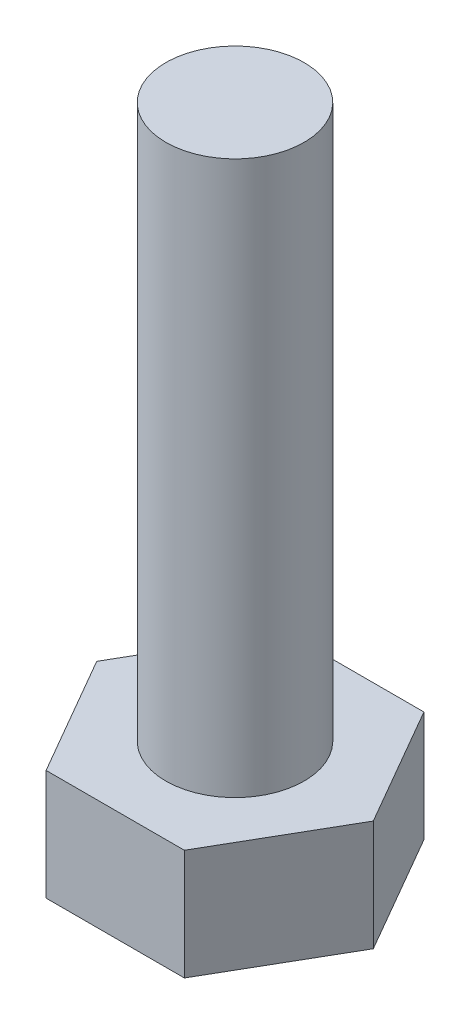
ISO-10303-21;
HEADER;
FILE_DESCRIPTION(('STEP AP214'),'2;1');
FILE_NAME('part.step','',(''),(''),'','','');
FILE_SCHEMA(('AUTOMOTIVE_DESIGN { 1 0 10303 214 1 1 1 1 }'));
ENDSEC;
DATA;
#1=APPLICATION_CONTEXT('core data for automotive mechanical design processes');
#2=APPLICATION_PROTOCOL_DEFINITION('international standard','automotive_design',2000,#1);
#3=PRODUCT_CONTEXT('',#1,'mechanical');
#4=PRODUCT('Part','Part','',(#3));
#5=PRODUCT_RELATED_PRODUCT_CATEGORY('part','',(#4));
#6=PRODUCT_DEFINITION_FORMATION('','',#4);
#7=PRODUCT_DEFINITION_CONTEXT('part definition',#1,'design');
#8=PRODUCT_DEFINITION('design','',#6,#7);
#9=PRODUCT_DEFINITION_SHAPE('','',#8);
#10=(LENGTH_UNIT() NAMED_UNIT(*) SI_UNIT(.MILLI.,.METRE.));
#11=(NAMED_UNIT(*) PLANE_ANGLE_UNIT() SI_UNIT($,.RADIAN.));
#12=(NAMED_UNIT(*) SI_UNIT($,.STERADIAN.) SOLID_ANGLE_UNIT());
#13=UNCERTAINTY_MEASURE_WITH_UNIT(LENGTH_MEASURE(1.E-05),#10,'distance_accuracy_value','');
#14=(GEOMETRIC_REPRESENTATION_CONTEXT(3) GLOBAL_UNCERTAINTY_ASSIGNED_CONTEXT((#13)) GLOBAL_UNIT_ASSIGNED_CONTEXT((#10,
#11,#12)) REPRESENTATION_CONTEXT('',''));
#15=CARTESIAN_POINT('',(0.,0.,0.));
#16=DIRECTION('',(0.,0.,1.));
#17=DIRECTION('',(1.,0.,0.));
#18=AXIS2_PLACEMENT_3D('',#15,#16,#17);
#19=CARTESIAN_POINT('',(2.5,2.,0.));
#20=DIRECTION('',(-0.866025403784439,0.,0.5));
#21=DIRECTION('',(0.5,0.,0.866025403784439));
#22=AXIS2_PLACEMENT_3D('',#19,#20,#21);
#23=PLANE('',#22);
#24=DIRECTION('',(-0.5,0.,-0.866025403784439));
#25=VECTOR('',#24,1.);
#26=CARTESIAN_POINT('',(2.5,0.,0.));
#27=LINE('',#26,#25);
#28=CARTESIAN_POINT('',(2.5,0.,0.));
#29=VERTEX_POINT('',#28);
#30=CARTESIAN_POINT('',(1.25,0.,-2.1650635094611));
#31=VERTEX_POINT('',#30);
#32=EDGE_CURVE('E134',#29,#31,#27,.T.);
#33=ORIENTED_EDGE('',*,*,#32,.T.);
#34=DIRECTION('',(0.,-1.,0.));
#35=VECTOR('',#34,1.);
#36=CARTESIAN_POINT('',(1.25,2.,-2.1650635094611));
#37=LINE('',#36,#35);
#38=CARTESIAN_POINT('',(1.25,2.,-2.1650635094611));
#39=VERTEX_POINT('',#38);
#40=EDGE_CURVE('E46',#39,#31,#37,.T.);
#41=ORIENTED_EDGE('',*,*,#40,.F.);
#42=DIRECTION('',(-0.5,0.,-0.866025403784439));
#43=VECTOR('',#42,1.);
#44=CARTESIAN_POINT('',(2.5,2.,0.));
#45=LINE('',#44,#43);
#46=CARTESIAN_POINT('',(2.5,2.,0.));
#47=VERTEX_POINT('',#46);
#48=EDGE_CURVE('E151',#47,#39,#45,.T.);
#49=ORIENTED_EDGE('',*,*,#48,.F.);
#50=DIRECTION('',(0.,-1.,0.));
#51=VECTOR('',#50,1.);
#52=CARTESIAN_POINT('',(2.5,2.,0.));
#53=LINE('',#52,#51);
#54=EDGE_CURVE('E130',#47,#29,#53,.T.);
#55=ORIENTED_EDGE('',*,*,#54,.T.);
#56=EDGE_LOOP('',(#33,#41,#49,#55));
#57=FACE_BOUND('',#56,.T.);
#58=ADVANCED_FACE('F43',(#57),#23,.F.);
#59=CARTESIAN_POINT('',(1.25,2.,-2.1650635094611));
#60=DIRECTION('',(0.,0.,1.));
#61=DIRECTION('',(1.,0.,0.));
#62=AXIS2_PLACEMENT_3D('',#59,#60,#61);
#63=PLANE('',#62);
#64=DIRECTION('',(-1.,0.,0.));
#65=VECTOR('',#64,1.);
#66=CARTESIAN_POINT('',(1.25,0.,-2.1650635094611));
#67=LINE('',#66,#65);
#68=CARTESIAN_POINT('',(-1.25,0.,-2.1650635094611));
#69=VERTEX_POINT('',#68);
#70=EDGE_CURVE('E138',#31,#69,#67,.T.);
#71=ORIENTED_EDGE('',*,*,#70,.T.);
#72=DIRECTION('',(0.,-1.,0.));
#73=VECTOR('',#72,1.);
#74=CARTESIAN_POINT('',(-1.25,2.,-2.1650635094611));
#75=LINE('',#74,#73);
#76=CARTESIAN_POINT('',(-1.25,2.,-2.1650635094611));
#77=VERTEX_POINT('',#76);
#78=EDGE_CURVE('E157',#77,#69,#75,.T.);
#79=ORIENTED_EDGE('',*,*,#78,.F.);
#80=DIRECTION('',(-1.,0.,0.));
#81=VECTOR('',#80,1.);
#82=CARTESIAN_POINT('',(1.25,2.,-2.1650635094611));
#83=LINE('',#82,#81);
#84=EDGE_CURVE('E99',#39,#77,#83,.T.);
#85=ORIENTED_EDGE('',*,*,#84,.F.);
#86=ORIENTED_EDGE('',*,*,#40,.T.);
#87=EDGE_LOOP('',(#71,#79,#85,#86));
#88=FACE_BOUND('',#87,.T.);
#89=ADVANCED_FACE('F164',(#88),#63,.F.);
#90=CARTESIAN_POINT('',(-1.25,2.,-2.1650635094611));
#91=DIRECTION('',(0.866025403784439,0.,0.5));
#92=DIRECTION('',(0.499999999999999,0.,-0.866025403784439));
#93=AXIS2_PLACEMENT_3D('',#90,#91,#92);
#94=PLANE('',#93);
#95=DIRECTION('',(-0.499999999999999,0.,0.866025403784439));
#96=VECTOR('',#95,1.);
#97=CARTESIAN_POINT('',(-1.25,0.,-2.1650635094611));
#98=LINE('',#97,#96);
#99=CARTESIAN_POINT('',(-2.5,0.,0.));
#100=VERTEX_POINT('',#99);
#101=EDGE_CURVE('E142',#69,#100,#98,.T.);
#102=ORIENTED_EDGE('',*,*,#101,.T.);
#103=DIRECTION('',(0.,-1.,0.));
#104=VECTOR('',#103,1.);
#105=CARTESIAN_POINT('',(-2.5,2.,0.));
#106=LINE('',#105,#104);
#107=CARTESIAN_POINT('',(-2.5,2.,0.));
#108=VERTEX_POINT('',#107);
#109=EDGE_CURVE('E123',#108,#100,#106,.T.);
#110=ORIENTED_EDGE('',*,*,#109,.F.);
#111=DIRECTION('',(-0.499999999999999,0.,0.866025403784439));
#112=VECTOR('',#111,1.);
#113=CARTESIAN_POINT('',(-1.25,2.,-2.1650635094611));
#114=LINE('',#113,#112);
#115=EDGE_CURVE('E112',#77,#108,#114,.T.);
#116=ORIENTED_EDGE('',*,*,#115,.F.);
#117=ORIENTED_EDGE('',*,*,#78,.T.);
#118=EDGE_LOOP('',(#102,#110,#116,#117));
#119=FACE_BOUND('',#118,.T.);
#120=ADVANCED_FACE('F170',(#119),#94,.F.);
#121=CARTESIAN_POINT('',(-2.5,2.,0.));
#122=DIRECTION('',(0.866025403784438,0.,-0.500000000000001));
#123=DIRECTION('',(-0.500000000000001,0.,-0.866025403784438));
#124=AXIS2_PLACEMENT_3D('',#121,#122,#123);
#125=PLANE('',#124);
#126=DIRECTION('',(0.5,0.,0.866025403784438));
#127=VECTOR('',#126,1.);
#128=CARTESIAN_POINT('',(-2.5,0.,0.));
#129=LINE('',#128,#127);
#130=CARTESIAN_POINT('',(-1.25,0.,2.1650635094611));
#131=VERTEX_POINT('',#130);
#132=EDGE_CURVE('E121',#100,#131,#129,.T.);
#133=ORIENTED_EDGE('',*,*,#132,.T.);
#134=DIRECTION('',(0.,-1.,0.));
#135=VECTOR('',#134,1.);
#136=CARTESIAN_POINT('',(-1.25,2.,2.1650635094611));
#137=LINE('',#136,#135);
#138=CARTESIAN_POINT('',(-1.25,2.,2.1650635094611));
#139=VERTEX_POINT('',#138);
#140=EDGE_CURVE('E118',#139,#131,#137,.T.);
#141=ORIENTED_EDGE('',*,*,#140,.F.);
#142=DIRECTION('',(0.5,0.,0.866025403784438));
#143=VECTOR('',#142,1.);
#144=CARTESIAN_POINT('',(-2.5,2.,0.));
#145=LINE('',#144,#143);
#146=EDGE_CURVE('E106',#108,#139,#145,.T.);
#147=ORIENTED_EDGE('',*,*,#146,.F.);
#148=ORIENTED_EDGE('',*,*,#109,.T.);
#149=EDGE_LOOP('',(#133,#141,#147,#148));
#150=FACE_BOUND('',#149,.T.);
#151=ADVANCED_FACE('F119',(#150),#125,.F.);
#152=CARTESIAN_POINT('',(-1.25,2.,2.1650635094611));
#153=DIRECTION('',(0.,0.,-1.));
#154=DIRECTION('',(-1.,0.,0.));
#155=AXIS2_PLACEMENT_3D('',#152,#153,#154);
#156=PLANE('',#155);
#157=DIRECTION('',(1.,0.,0.));
#158=VECTOR('',#157,1.);
#159=CARTESIAN_POINT('',(-1.25,0.,2.1650635094611));
#160=LINE('',#159,#158);
#161=CARTESIAN_POINT('',(1.25,0.,2.1650635094611));
#162=VERTEX_POINT('',#161);
#163=EDGE_CURVE('E84',#131,#162,#160,.T.);
#164=ORIENTED_EDGE('',*,*,#163,.T.);
#165=DIRECTION('',(0.,-1.,0.));
#166=VECTOR('',#165,1.);
#167=CARTESIAN_POINT('',(1.25,2.,2.1650635094611));
#168=LINE('',#167,#166);
#169=CARTESIAN_POINT('',(1.25,2.,2.1650635094611));
#170=VERTEX_POINT('',#169);
#171=EDGE_CURVE('E124',#170,#162,#168,.T.);
#172=ORIENTED_EDGE('',*,*,#171,.F.);
#173=DIRECTION('',(1.,0.,0.));
#174=VECTOR('',#173,1.);
#175=CARTESIAN_POINT('',(-1.25,2.,2.1650635094611));
#176=LINE('',#175,#174);
#177=EDGE_CURVE('E110',#139,#170,#176,.T.);
#178=ORIENTED_EDGE('',*,*,#177,.F.);
#179=ORIENTED_EDGE('',*,*,#140,.T.);
#180=EDGE_LOOP('',(#164,#172,#178,#179));
#181=FACE_BOUND('',#180,.T.);
#182=ADVANCED_FACE('F126',(#181),#156,.F.);
#183=CARTESIAN_POINT('',(1.25,2.,2.1650635094611));
#184=DIRECTION('',(-0.866025403784439,0.,-0.5));
#185=DIRECTION('',(-0.5,0.,0.866025403784439));
#186=AXIS2_PLACEMENT_3D('',#183,#184,#185);
#187=PLANE('',#186);
#188=DIRECTION('',(0.5,0.,-0.866025403784439));
#189=VECTOR('',#188,1.);
#190=CARTESIAN_POINT('',(1.25,0.,2.1650635094611));
#191=LINE('',#190,#189);
#192=EDGE_CURVE('E90',#162,#29,#191,.T.);
#193=ORIENTED_EDGE('',*,*,#192,.T.);
#194=ORIENTED_EDGE('',*,*,#54,.F.);
#195=DIRECTION('',(0.5,0.,-0.866025403784439));
#196=VECTOR('',#195,1.);
#197=CARTESIAN_POINT('',(1.25,2.,2.1650635094611));
#198=LINE('',#197,#196);
#199=EDGE_CURVE('E61',#170,#47,#198,.T.);
#200=ORIENTED_EDGE('',*,*,#199,.F.);
#201=ORIENTED_EDGE('',*,*,#171,.T.);
#202=EDGE_LOOP('',(#193,#194,#200,#201));
#203=FACE_BOUND('',#202,.T.);
#204=ADVANCED_FACE('F190',(#203),#187,.F.);
#205=CARTESIAN_POINT('',(0.,2.,0.));
#206=DIRECTION('',(0.,1.,0.));
#207=DIRECTION('',(0.,0.,1.));
#208=AXIS2_PLACEMENT_3D('',#205,#206,#207);
#209=PLANE('',#208);
#210=CARTESIAN_POINT('',(0.,2.,0.));
#211=DIRECTION('',(0.,1.,0.));
#212=DIRECTION('',(0.,0.,1.));
#213=AXIS2_PLACEMENT_3D('',#210,#211,#212);
#214=CIRCLE('',#213,1.25);
#215=CARTESIAN_POINT('',(0.,2.,1.25));
#216=VERTEX_POINT('',#215);
#217=EDGE_CURVE('E11',#216,#216,#214,.T.);
#218=ORIENTED_EDGE('',*,*,#217,.F.);
#219=EDGE_LOOP('',(#218));
#220=FACE_BOUND('',#219,.T.);
#221=ORIENTED_EDGE('',*,*,#48,.T.);
#222=ORIENTED_EDGE('',*,*,#84,.T.);
#223=ORIENTED_EDGE('',*,*,#115,.T.);
#224=ORIENTED_EDGE('',*,*,#146,.T.);
#225=ORIENTED_EDGE('',*,*,#177,.T.);
#226=ORIENTED_EDGE('',*,*,#199,.T.);
#227=EDGE_LOOP('',(#221,#222,#223,#224,#225,#226));
#228=FACE_BOUND('',#227,.T.);
#229=ADVANCED_FACE('F108',(#220,#228),#209,.T.);
#230=CARTESIAN_POINT('',(0.,0.,0.));
#231=DIRECTION('',(0.,1.,0.));
#232=DIRECTION('',(0.,0.,1.));
#233=AXIS2_PLACEMENT_3D('',#230,#231,#232);
#234=PLANE('',#233);
#235=ORIENTED_EDGE('',*,*,#32,.F.);
#236=ORIENTED_EDGE('',*,*,#192,.F.);
#237=ORIENTED_EDGE('',*,*,#163,.F.);
#238=ORIENTED_EDGE('',*,*,#132,.F.);
#239=ORIENTED_EDGE('',*,*,#101,.F.);
#240=ORIENTED_EDGE('',*,*,#70,.F.);
#241=EDGE_LOOP('',(#235,#236,#237,#238,#239,#240));
#242=FACE_BOUND('',#241,.T.);
#243=ADVANCED_FACE('F169',(#242),#234,.F.);
#244=CARTESIAN_POINT('',(0.,12.,0.));
#245=DIRECTION('',(0.,-1.,0.));
#246=DIRECTION('',(0.,0.,-1.));
#247=AXIS2_PLACEMENT_3D('',#244,#245,#246);
#248=CYLINDRICAL_SURFACE('',#247,1.25);
#249=CARTESIAN_POINT('',(0.,12.,0.));
#250=DIRECTION('',(0.,1.,0.));
#251=DIRECTION('',(0.,0.,1.));
#252=AXIS2_PLACEMENT_3D('',#249,#250,#251);
#253=CIRCLE('',#252,1.25);
#254=CARTESIAN_POINT('',(0.,12.,1.25));
#255=VERTEX_POINT('',#254);
#256=EDGE_CURVE('E139',#255,#255,#253,.T.);
#257=ORIENTED_EDGE('',*,*,#256,.F.);
#258=EDGE_LOOP('',(#257));
#259=FACE_BOUND('',#258,.T.);
#260=ORIENTED_EDGE('',*,*,#217,.T.);
#261=EDGE_LOOP('',(#260));
#262=FACE_BOUND('',#261,.T.);
#263=ADVANCED_FACE('F183',(#259,#262),#248,.T.);
#264=CARTESIAN_POINT('',(0.,12.,0.));
#265=DIRECTION('',(0.,1.,0.));
#266=DIRECTION('',(0.,0.,1.));
#267=AXIS2_PLACEMENT_3D('',#264,#265,#266);
#268=PLANE('',#267);
#269=ORIENTED_EDGE('',*,*,#256,.T.);
#270=EDGE_LOOP('',(#269));
#271=FACE_BOUND('',#270,.T.);
#272=ADVANCED_FACE('F181',(#271),#268,.T.);
#273=CLOSED_SHELL('',(#58,#89,#120,#151,#182,#204,#229,#243,#263,#272));
#274=MANIFOLD_SOLID_BREP('B2',#273);
#275=ADVANCED_BREP_SHAPE_REPRESENTATION('',(#18,#274),#14);
#276=SHAPE_DEFINITION_REPRESENTATION(#9,#275);
ENDSEC;
END-ISO-10303-21;
